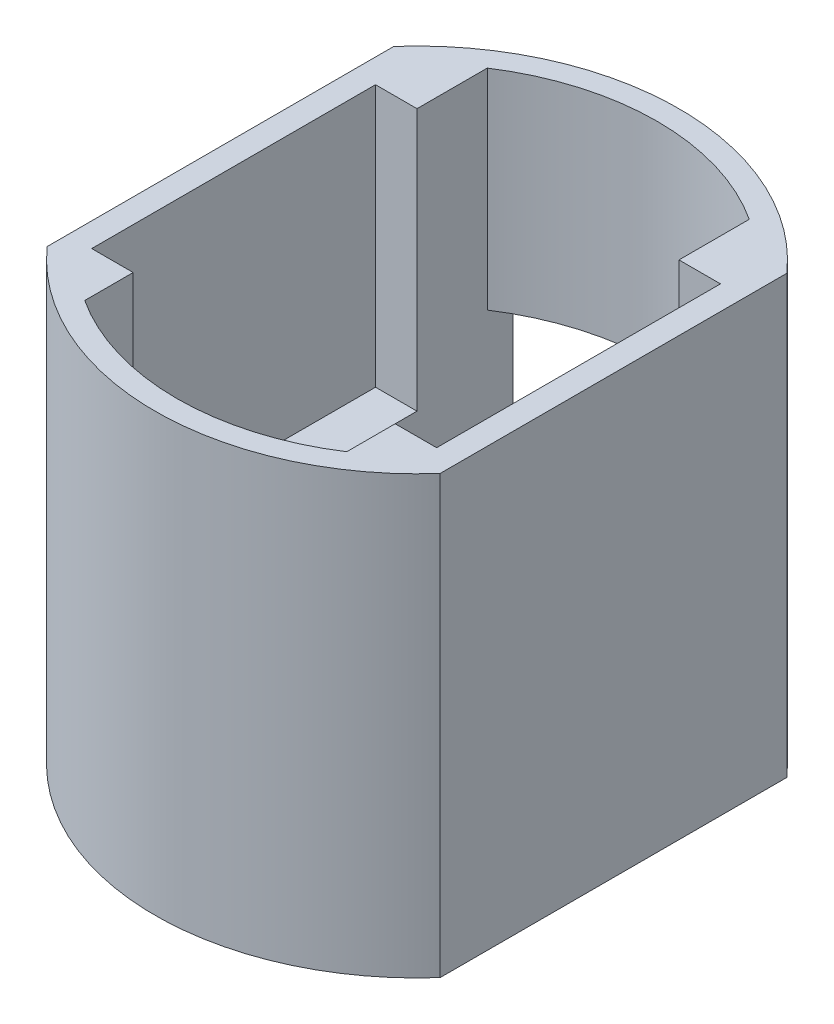
ISO-10303-21;
HEADER;
FILE_DESCRIPTION(('STEP AP214'),'2;1');
FILE_NAME('part.step','',(''),(''),'','','');
FILE_SCHEMA(('AUTOMOTIVE_DESIGN { 1 0 10303 214 1 1 1 1 }'));
ENDSEC;
DATA;
#1=APPLICATION_CONTEXT('core data for automotive mechanical design processes');
#2=APPLICATION_PROTOCOL_DEFINITION('international standard','automotive_design',2000,#1);
#3=PRODUCT_CONTEXT('',#1,'mechanical');
#4=PRODUCT('Part','Part','',(#3));
#5=PRODUCT_RELATED_PRODUCT_CATEGORY('part','',(#4));
#6=PRODUCT_DEFINITION_FORMATION('','',#4);
#7=PRODUCT_DEFINITION_CONTEXT('part definition',#1,'design');
#8=PRODUCT_DEFINITION('design','',#6,#7);
#9=PRODUCT_DEFINITION_SHAPE('','',#8);
#10=(LENGTH_UNIT() NAMED_UNIT(*) SI_UNIT(.MILLI.,.METRE.));
#11=(NAMED_UNIT(*) PLANE_ANGLE_UNIT() SI_UNIT($,.RADIAN.));
#12=(NAMED_UNIT(*) SI_UNIT($,.STERADIAN.) SOLID_ANGLE_UNIT());
#13=UNCERTAINTY_MEASURE_WITH_UNIT(LENGTH_MEASURE(1.E-05),#10,'distance_accuracy_value','');
#14=(GEOMETRIC_REPRESENTATION_CONTEXT(3) GLOBAL_UNCERTAINTY_ASSIGNED_CONTEXT((#13)) GLOBAL_UNIT_ASSIGNED_CONTEXT((#10,
#11,#12)) REPRESENTATION_CONTEXT('',''));
#15=CARTESIAN_POINT('',(0.,0.,0.));
#16=DIRECTION('',(0.,0.,1.));
#17=DIRECTION('',(1.,0.,0.));
#18=AXIS2_PLACEMENT_3D('',#15,#16,#17);
#19=CARTESIAN_POINT('',(-38.1,50.8,58.5441073038098));
#20=DIRECTION('',(-1.,0.,0.));
#21=DIRECTION('',(0.,0.,1.));
#22=AXIS2_PLACEMENT_3D('',#19,#20,#21);
#23=PLANE('',#22);
#24=DIRECTION('',(0.,0.,1.));
#25=VECTOR('',#24,1.);
#26=CARTESIAN_POINT('',(-38.1,50.8,58.5441073038098));
#27=LINE('',#26,#25);
#28=CARTESIAN_POINT('',(-38.1,50.8,44.45));
#29=VERTEX_POINT('',#28);
#30=CARTESIAN_POINT('',(-38.1,50.8,58.5441073038098));
#31=VERTEX_POINT('',#30);
#32=EDGE_CURVE('E320',#29,#31,#27,.T.);
#33=ORIENTED_EDGE('',*,*,#32,.F.);
#34=DIRECTION('',(0.,1.,0.));
#35=VECTOR('',#34,1.);
#36=CARTESIAN_POINT('',(-38.1,50.8,44.45));
#37=LINE('',#36,#35);
#38=CARTESIAN_POINT('',(-38.1,127.,44.45));
#39=VERTEX_POINT('',#38);
#40=EDGE_CURVE('E244',#29,#39,#37,.T.);
#41=ORIENTED_EDGE('',*,*,#40,.T.);
#42=DIRECTION('',(0.,0.,1.));
#43=VECTOR('',#42,1.);
#44=CARTESIAN_POINT('',(-38.1,127.,58.5441073038098));
#45=LINE('',#44,#43);
#46=CARTESIAN_POINT('',(-38.1,127.,58.5441073038098));
#47=VERTEX_POINT('',#46);
#48=EDGE_CURVE('E335',#39,#47,#45,.T.);
#49=ORIENTED_EDGE('',*,*,#48,.T.);
#50=DIRECTION('',(0.,1.,0.));
#51=VECTOR('',#50,1.);
#52=CARTESIAN_POINT('',(-38.1,50.8,58.5441073038098));
#53=LINE('',#52,#51);
#54=EDGE_CURVE('E338',#31,#47,#53,.T.);
#55=ORIENTED_EDGE('',*,*,#54,.F.);
#56=EDGE_LOOP('',(#33,#41,#49,#55));
#57=FACE_BOUND('',#56,.T.);
#58=ADVANCED_FACE('F39',(#57),#23,.F.);
#59=CARTESIAN_POINT('',(38.1,50.8,58.5441073038098));
#60=DIRECTION('',(1.,0.,0.));
#61=DIRECTION('',(0.,0.,-1.));
#62=AXIS2_PLACEMENT_3D('',#59,#60,#61);
#63=PLANE('',#62);
#64=DIRECTION('',(0.,0.,-1.));
#65=VECTOR('',#64,1.);
#66=CARTESIAN_POINT('',(38.1,127.,58.5441073038098));
#67=LINE('',#66,#65);
#68=CARTESIAN_POINT('',(38.1,127.,58.5441073038098));
#69=VERTEX_POINT('',#68);
#70=CARTESIAN_POINT('',(38.1,127.,44.45));
#71=VERTEX_POINT('',#70);
#72=EDGE_CURVE('E327',#69,#71,#67,.T.);
#73=ORIENTED_EDGE('',*,*,#72,.T.);
#74=DIRECTION('',(0.,-1.,0.));
#75=VECTOR('',#74,1.);
#76=CARTESIAN_POINT('',(38.1,50.8,44.45));
#77=LINE('',#76,#75);
#78=CARTESIAN_POINT('',(38.1,50.8,44.45));
#79=VERTEX_POINT('',#78);
#80=EDGE_CURVE('E238',#71,#79,#77,.T.);
#81=ORIENTED_EDGE('',*,*,#80,.T.);
#82=DIRECTION('',(0.,0.,-1.));
#83=VECTOR('',#82,1.);
#84=CARTESIAN_POINT('',(38.1,50.8,58.5441073038098));
#85=LINE('',#84,#83);
#86=CARTESIAN_POINT('',(38.1,50.8,58.5441073038098));
#87=VERTEX_POINT('',#86);
#88=EDGE_CURVE('E315',#87,#79,#85,.T.);
#89=ORIENTED_EDGE('',*,*,#88,.F.);
#90=DIRECTION('',(0.,1.,0.));
#91=VECTOR('',#90,1.);
#92=CARTESIAN_POINT('',(38.1,50.8,58.5441073038098));
#93=LINE('',#92,#91);
#94=EDGE_CURVE('E323',#87,#69,#93,.T.);
#95=ORIENTED_EDGE('',*,*,#94,.T.);
#96=EDGE_LOOP('',(#73,#81,#89,#95));
#97=FACE_BOUND('',#96,.T.);
#98=ADVANCED_FACE('F443',(#97),#63,.F.);
#99=CARTESIAN_POINT('',(0.,127.,0.));
#100=DIRECTION('',(0.,-1.,0.));
#101=DIRECTION('',(0.,0.,-1.));
#102=AXIS2_PLACEMENT_3D('',#99,#100,#101);
#103=CYLINDRICAL_SURFACE('',#102,76.2);
#104=CARTESIAN_POINT('',(0.,127.,0.));
#105=DIRECTION('',(0.,1.,0.));
#106=DIRECTION('',(0.,0.,1.));
#107=AXIS2_PLACEMENT_3D('',#104,#105,#106);
#108=CIRCLE('',#107,76.2);
#109=CARTESIAN_POINT('',(-57.15,127.,50.4015624757805));
#110=VERTEX_POINT('',#109);
#111=CARTESIAN_POINT('',(57.15,127.,50.4015624757805));
#112=VERTEX_POINT('',#111);
#113=EDGE_CURVE('E353',#110,#112,#108,.T.);
#114=ORIENTED_EDGE('',*,*,#113,.F.);
#115=DIRECTION('',(0.,1.,0.));
#116=VECTOR('',#115,1.);
#117=CARTESIAN_POINT('',(-57.15,0.,50.4015624757805));
#118=LINE('',#117,#116);
#119=CARTESIAN_POINT('',(-57.15,0.,50.4015624757805));
#120=VERTEX_POINT('',#119);
#121=EDGE_CURVE('E254',#120,#110,#118,.T.);
#122=ORIENTED_EDGE('',*,*,#121,.F.);
#123=CARTESIAN_POINT('',(0.,0.,0.));
#124=DIRECTION('',(0.,1.,0.));
#125=DIRECTION('',(0.,0.,1.));
#126=AXIS2_PLACEMENT_3D('',#123,#124,#125);
#127=CIRCLE('',#126,76.2);
#128=CARTESIAN_POINT('',(57.15,0.,50.4015624757805));
#129=VERTEX_POINT('',#128);
#130=EDGE_CURVE('E361',#120,#129,#127,.T.);
#131=ORIENTED_EDGE('',*,*,#130,.T.);
#132=DIRECTION('',(0.,1.,0.));
#133=VECTOR('',#132,1.);
#134=CARTESIAN_POINT('',(57.15,0.,50.4015624757805));
#135=LINE('',#134,#133);
#136=EDGE_CURVE('E55',#129,#112,#135,.T.);
#137=ORIENTED_EDGE('',*,*,#136,.T.);
#138=EDGE_LOOP('',(#114,#122,#131,#137));
#139=FACE_BOUND('',#138,.T.);
#140=ADVANCED_FACE('F388',(#139),#103,.T.);
#141=CARTESIAN_POINT('',(0.,50.8,0.));
#142=DIRECTION('',(0.,1.,0.));
#143=DIRECTION('',(0.,0.,1.));
#144=AXIS2_PLACEMENT_3D('',#141,#142,#143);
#145=CYLINDRICAL_SURFACE('',#144,69.85);
#146=CARTESIAN_POINT('',(0.,66.04,0.));
#147=DIRECTION('',(0.,-1.,0.));
#148=DIRECTION('',(0.,0.,-1.));
#149=AXIS2_PLACEMENT_3D('',#146,#147,#148);
#150=CIRCLE('',#149,69.85);
#151=CARTESIAN_POINT('',(38.1,66.04,-58.5441073038098));
#152=VERTEX_POINT('',#151);
#153=CARTESIAN_POINT('',(-38.1,66.04,-58.5441073038098));
#154=VERTEX_POINT('',#153);
#155=EDGE_CURVE('E297',#152,#154,#150,.F.);
#156=ORIENTED_EDGE('',*,*,#155,.F.);
#157=DIRECTION('',(0.,1.,0.));
#158=VECTOR('',#157,1.);
#159=CARTESIAN_POINT('',(38.1,50.8,-58.5441073038098));
#160=LINE('',#159,#158);
#161=CARTESIAN_POINT('',(38.1,127.,-58.5441073038098));
#162=VERTEX_POINT('',#161);
#163=EDGE_CURVE('E346',#152,#162,#160,.T.);
#164=ORIENTED_EDGE('',*,*,#163,.T.);
#165=CARTESIAN_POINT('',(0.,127.,0.));
#166=DIRECTION('',(0.,1.,0.));
#167=DIRECTION('',(0.,0.,1.));
#168=AXIS2_PLACEMENT_3D('',#165,#166,#167);
#169=CIRCLE('',#168,69.85);
#170=CARTESIAN_POINT('',(-38.1,127.,-58.5441073038098));
#171=VERTEX_POINT('',#170);
#172=EDGE_CURVE('E331',#162,#171,#169,.T.);
#173=ORIENTED_EDGE('',*,*,#172,.T.);
#174=DIRECTION('',(0.,1.,0.));
#175=VECTOR('',#174,1.);
#176=CARTESIAN_POINT('',(-38.1,50.8,-58.5441073038098));
#177=LINE('',#176,#175);
#178=EDGE_CURVE('E343',#154,#171,#177,.T.);
#179=ORIENTED_EDGE('',*,*,#178,.F.);
#180=EDGE_LOOP('',(#156,#164,#173,#179));
#181=FACE_BOUND('',#180,.T.);
#182=ADVANCED_FACE('F430',(#181),#145,.F.);
#183=CARTESIAN_POINT('',(-38.1,0.,-65.9911357683742));
#184=VERTEX_POINT('',#183);
#185=CARTESIAN_POINT('',(-57.15,0.,-50.4015624757805));
#186=VERTEX_POINT('',#185);
#187=EDGE_CURVE('E358',#184,#186,#127,.T.);
#188=ORIENTED_EDGE('',*,*,#187,.T.);
#189=DIRECTION('',(0.,1.,0.));
#190=VECTOR('',#189,1.);
#191=CARTESIAN_POINT('',(-57.15,0.,-50.4015624757805));
#192=LINE('',#191,#190);
#193=CARTESIAN_POINT('',(-57.15,127.,-50.4015624757805));
#194=VERTEX_POINT('',#193);
#195=EDGE_CURVE('E63',#186,#194,#192,.T.);
#196=ORIENTED_EDGE('',*,*,#195,.T.);
#197=CARTESIAN_POINT('',(57.15,127.,-50.4015624757805));
#198=VERTEX_POINT('',#197);
#199=EDGE_CURVE('E357',#198,#194,#108,.T.);
#200=ORIENTED_EDGE('',*,*,#199,.F.);
#201=DIRECTION('',(0.,1.,0.));
#202=VECTOR('',#201,1.);
#203=CARTESIAN_POINT('',(57.15,0.,-50.4015624757805));
#204=LINE('',#203,#202);
#205=CARTESIAN_POINT('',(57.15,0.,-50.4015624757805));
#206=VERTEX_POINT('',#205);
#207=EDGE_CURVE('E266',#206,#198,#204,.T.);
#208=ORIENTED_EDGE('',*,*,#207,.F.);
#209=CARTESIAN_POINT('',(38.1,0.,-65.9911357683742));
#210=VERTEX_POINT('',#209);
#211=EDGE_CURVE('E342',#206,#210,#127,.T.);
#212=ORIENTED_EDGE('',*,*,#211,.T.);
#213=DIRECTION('',(0.,-1.,0.));
#214=VECTOR('',#213,1.);
#215=CARTESIAN_POINT('',(38.1,66.04,-65.9911357683742));
#216=LINE('',#215,#214);
#217=CARTESIAN_POINT('',(38.1,66.04,-65.9911357683742));
#218=VERTEX_POINT('',#217);
#219=EDGE_CURVE('E301',#218,#210,#216,.T.);
#220=ORIENTED_EDGE('',*,*,#219,.F.);
#221=CARTESIAN_POINT('',(0.,66.04,0.));
#222=DIRECTION('',(0.,-1.,0.));
#223=DIRECTION('',(0.,0.,-1.));
#224=AXIS2_PLACEMENT_3D('',#221,#222,#223);
#225=CIRCLE('',#224,76.2);
#226=CARTESIAN_POINT('',(-38.1,66.04,-65.9911357683742));
#227=VERTEX_POINT('',#226);
#228=EDGE_CURVE('E276',#227,#218,#225,.T.);
#229=ORIENTED_EDGE('',*,*,#228,.F.);
#230=DIRECTION('',(0.,-1.,0.));
#231=VECTOR('',#230,1.);
#232=CARTESIAN_POINT('',(-38.1,66.04,-65.9911357683742));
#233=LINE('',#232,#231);
#234=EDGE_CURVE('E284',#227,#184,#233,.T.);
#235=ORIENTED_EDGE('',*,*,#234,.T.);
#236=EDGE_LOOP('',(#188,#196,#200,#208,#212,#220,#229,#235));
#237=FACE_BOUND('',#236,.T.);
#238=ADVANCED_FACE('F41',(#237),#103,.T.);
#239=CARTESIAN_POINT('',(0.,127.,0.));
#240=DIRECTION('',(0.,1.,0.));
#241=DIRECTION('',(0.,0.,1.));
#242=AXIS2_PLACEMENT_3D('',#239,#240,#241);
#243=PLANE('',#242);
#244=DIRECTION('',(-1.,0.,0.));
#245=VECTOR('',#244,1.);
#246=CARTESIAN_POINT('',(50.165,127.,-38.1));
#247=LINE('',#246,#245);
#248=CARTESIAN_POINT('',(50.165,127.,-38.1));
#249=VERTEX_POINT('',#248);
#250=CARTESIAN_POINT('',(38.1,127.,-38.1));
#251=VERTEX_POINT('',#250);
#252=EDGE_CURVE('E189',#249,#251,#247,.T.);
#253=ORIENTED_EDGE('',*,*,#252,.F.);
#254=DIRECTION('',(0.,0.,-1.));
#255=VECTOR('',#254,1.);
#256=CARTESIAN_POINT('',(50.165,127.,-38.1));
#257=LINE('',#256,#255);
#258=CARTESIAN_POINT('',(50.165,127.,44.45));
#259=VERTEX_POINT('',#258);
#260=EDGE_CURVE('E202',#259,#249,#257,.T.);
#261=ORIENTED_EDGE('',*,*,#260,.F.);
#262=DIRECTION('',(1.,0.,0.));
#263=VECTOR('',#262,1.);
#264=CARTESIAN_POINT('',(50.165,127.,44.45));
#265=LINE('',#264,#263);
#266=EDGE_CURVE('E210',#71,#259,#265,.T.);
#267=ORIENTED_EDGE('',*,*,#266,.F.);
#268=ORIENTED_EDGE('',*,*,#72,.F.);
#269=CARTESIAN_POINT('',(0.,127.,0.));
#270=DIRECTION('',(0.,1.,0.));
#271=DIRECTION('',(0.,0.,1.));
#272=AXIS2_PLACEMENT_3D('',#269,#270,#271);
#273=CIRCLE('',#272,69.85);
#274=EDGE_CURVE('E310',#47,#69,#273,.T.);
#275=ORIENTED_EDGE('',*,*,#274,.F.);
#276=ORIENTED_EDGE('',*,*,#48,.F.);
#277=CARTESIAN_POINT('',(-50.165,127.,44.45));
#278=VERTEX_POINT('',#277);
#279=EDGE_CURVE('E208',#278,#39,#265,.T.);
#280=ORIENTED_EDGE('',*,*,#279,.F.);
#281=DIRECTION('',(0.,0.,1.));
#282=VECTOR('',#281,1.);
#283=CARTESIAN_POINT('',(-50.165,127.,-38.1));
#284=LINE('',#283,#282);
#285=CARTESIAN_POINT('',(-50.165,127.,-38.1));
#286=VERTEX_POINT('',#285);
#287=EDGE_CURVE('E195',#286,#278,#284,.T.);
#288=ORIENTED_EDGE('',*,*,#287,.F.);
#289=CARTESIAN_POINT('',(-38.1,127.,-38.1));
#290=VERTEX_POINT('',#289);
#291=EDGE_CURVE('E177',#290,#286,#247,.T.);
#292=ORIENTED_EDGE('',*,*,#291,.F.);
#293=EDGE_CURVE('E316',#171,#290,#45,.T.);
#294=ORIENTED_EDGE('',*,*,#293,.F.);
#295=ORIENTED_EDGE('',*,*,#172,.F.);
#296=EDGE_CURVE('E326',#251,#162,#67,.T.);
#297=ORIENTED_EDGE('',*,*,#296,.F.);
#298=EDGE_LOOP('',(#253,#261,#267,#268,#275,#276,#280,#288,#292,#294,#295,#297));
#299=FACE_BOUND('',#298,.T.);
#300=DIRECTION('',(0.,0.,-1.));
#301=VECTOR('',#300,1.);
#302=CARTESIAN_POINT('',(-57.15,127.,-50.4015624757805));
#303=LINE('',#302,#301);
#304=EDGE_CURVE('E255',#110,#194,#303,.T.);
#305=ORIENTED_EDGE('',*,*,#304,.F.);
#306=ORIENTED_EDGE('',*,*,#113,.T.);
#307=DIRECTION('',(0.,0.,1.));
#308=VECTOR('',#307,1.);
#309=CARTESIAN_POINT('',(57.15,127.,-50.4015624757805));
#310=LINE('',#309,#308);
#311=EDGE_CURVE('E250',#198,#112,#310,.T.);
#312=ORIENTED_EDGE('',*,*,#311,.F.);
#313=ORIENTED_EDGE('',*,*,#199,.T.);
#314=EDGE_LOOP('',(#305,#306,#312,#313));
#315=FACE_BOUND('',#314,.T.);
#316=ADVANCED_FACE('F205',(#299,#315),#243,.T.);
#317=CARTESIAN_POINT('',(0.,0.,0.));
#318=DIRECTION('',(0.,1.,0.));
#319=DIRECTION('',(0.,0.,1.));
#320=AXIS2_PLACEMENT_3D('',#317,#318,#319);
#321=PLANE('',#320);
#322=ORIENTED_EDGE('',*,*,#130,.F.);
#323=DIRECTION('',(0.,0.,-1.));
#324=VECTOR('',#323,1.);
#325=CARTESIAN_POINT('',(-57.15,0.,-50.4015624757805));
#326=LINE('',#325,#324);
#327=EDGE_CURVE('E251',#120,#186,#326,.T.);
#328=ORIENTED_EDGE('',*,*,#327,.T.);
#329=ORIENTED_EDGE('',*,*,#187,.F.);
#330=DIRECTION('',(0.,0.,-1.));
#331=VECTOR('',#330,1.);
#332=CARTESIAN_POINT('',(-38.1,0.,0.));
#333=LINE('',#332,#331);
#334=CARTESIAN_POINT('',(-38.1,0.,23.1617739424834));
#335=VERTEX_POINT('',#334);
#336=EDGE_CURVE('E260',#335,#184,#333,.T.);
#337=ORIENTED_EDGE('',*,*,#336,.F.);
#338=DIRECTION('',(-1.,0.,0.));
#339=VECTOR('',#338,1.);
#340=CARTESIAN_POINT('',(0.,0.,23.1617739424834));
#341=LINE('',#340,#339);
#342=CARTESIAN_POINT('',(38.1,0.,23.1617739424834));
#343=VERTEX_POINT('',#342);
#344=EDGE_CURVE('E277',#343,#335,#341,.T.);
#345=ORIENTED_EDGE('',*,*,#344,.F.);
#346=DIRECTION('',(0.,0.,-1.));
#347=VECTOR('',#346,1.);
#348=CARTESIAN_POINT('',(38.1,0.,0.));
#349=LINE('',#348,#347);
#350=EDGE_CURVE('E287',#343,#210,#349,.T.);
#351=ORIENTED_EDGE('',*,*,#350,.T.);
#352=ORIENTED_EDGE('',*,*,#211,.F.);
#353=DIRECTION('',(0.,0.,1.));
#354=VECTOR('',#353,1.);
#355=CARTESIAN_POINT('',(57.15,0.,-50.4015624757805));
#356=LINE('',#355,#354);
#357=EDGE_CURVE('E263',#206,#129,#356,.T.);
#358=ORIENTED_EDGE('',*,*,#357,.T.);
#359=EDGE_LOOP('',(#322,#328,#329,#337,#345,#351,#352,#358));
#360=FACE_BOUND('',#359,.T.);
#361=ADVANCED_FACE('F382',(#360),#321,.F.);
#362=CARTESIAN_POINT('',(0.,50.8,0.));
#363=DIRECTION('',(0.,1.,0.));
#364=DIRECTION('',(0.,0.,1.));
#365=AXIS2_PLACEMENT_3D('',#362,#363,#364);
#366=CYLINDRICAL_SURFACE('',#365,69.85);
#367=ORIENTED_EDGE('',*,*,#274,.T.);
#368=ORIENTED_EDGE('',*,*,#94,.F.);
#369=CARTESIAN_POINT('',(0.,50.8,0.));
#370=DIRECTION('',(0.,1.,0.));
#371=DIRECTION('',(0.,0.,1.));
#372=AXIS2_PLACEMENT_3D('',#369,#370,#371);
#373=CIRCLE('',#372,69.85);
#374=EDGE_CURVE('E311',#31,#87,#373,.T.);
#375=ORIENTED_EDGE('',*,*,#374,.F.);
#376=ORIENTED_EDGE('',*,*,#54,.T.);
#377=EDGE_LOOP('',(#367,#368,#375,#376));
#378=FACE_BOUND('',#377,.T.);
#379=ADVANCED_FACE('F438',(#378),#366,.F.);
#380=ORIENTED_EDGE('',*,*,#293,.T.);
#381=DIRECTION('',(0.,-1.,0.));
#382=VECTOR('',#381,1.);
#383=CARTESIAN_POINT('',(-38.1,50.8,-38.1));
#384=LINE('',#383,#382);
#385=CARTESIAN_POINT('',(-38.1,50.8,-38.1));
#386=VERTEX_POINT('',#385);
#387=EDGE_CURVE('E183',#290,#386,#384,.T.);
#388=ORIENTED_EDGE('',*,*,#387,.T.);
#389=DIRECTION('',(0.,0.,-1.));
#390=VECTOR('',#389,1.);
#391=CARTESIAN_POINT('',(-38.1,50.8,58.5441073038098));
#392=LINE('',#391,#390);
#393=CARTESIAN_POINT('',(-38.1,50.8,23.1617739424834));
#394=VERTEX_POINT('',#393);
#395=EDGE_CURVE('E233',#394,#386,#392,.T.);
#396=ORIENTED_EDGE('',*,*,#395,.F.);
#397=DIRECTION('',(0.,-1.,0.));
#398=VECTOR('',#397,1.);
#399=CARTESIAN_POINT('',(-38.1,66.04,23.1617739424834));
#400=LINE('',#399,#398);
#401=EDGE_CURVE('E294',#394,#335,#400,.T.);
#402=ORIENTED_EDGE('',*,*,#401,.T.);
#403=ORIENTED_EDGE('',*,*,#336,.T.);
#404=ORIENTED_EDGE('',*,*,#234,.F.);
#405=DIRECTION('',(0.,0.,-1.));
#406=VECTOR('',#405,1.);
#407=CARTESIAN_POINT('',(-38.1,66.04,0.));
#408=LINE('',#407,#406);
#409=EDGE_CURVE('E273',#154,#227,#408,.T.);
#410=ORIENTED_EDGE('',*,*,#409,.F.);
#411=ORIENTED_EDGE('',*,*,#178,.T.);
#412=EDGE_LOOP('',(#380,#388,#396,#402,#403,#404,#410,#411));
#413=FACE_BOUND('',#412,.T.);
#414=ADVANCED_FACE('F424',(#413),#23,.F.);
#415=DIRECTION('',(0.,0.,1.));
#416=VECTOR('',#415,1.);
#417=CARTESIAN_POINT('',(38.1,50.8,58.5441073038098));
#418=LINE('',#417,#416);
#419=CARTESIAN_POINT('',(38.1,50.8,-38.1));
#420=VERTEX_POINT('',#419);
#421=CARTESIAN_POINT('',(38.1,50.8,23.1617739424834));
#422=VERTEX_POINT('',#421);
#423=EDGE_CURVE('E235',#420,#422,#418,.T.);
#424=ORIENTED_EDGE('',*,*,#423,.F.);
#425=DIRECTION('',(0.,1.,0.));
#426=VECTOR('',#425,1.);
#427=CARTESIAN_POINT('',(38.1,50.8,-38.1));
#428=LINE('',#427,#426);
#429=EDGE_CURVE('E11',#420,#251,#428,.T.);
#430=ORIENTED_EDGE('',*,*,#429,.T.);
#431=ORIENTED_EDGE('',*,*,#296,.T.);
#432=ORIENTED_EDGE('',*,*,#163,.F.);
#433=DIRECTION('',(0.,0.,-1.));
#434=VECTOR('',#433,1.);
#435=CARTESIAN_POINT('',(38.1,66.04,0.));
#436=LINE('',#435,#434);
#437=EDGE_CURVE('E281',#152,#218,#436,.T.);
#438=ORIENTED_EDGE('',*,*,#437,.T.);
#439=ORIENTED_EDGE('',*,*,#219,.T.);
#440=ORIENTED_EDGE('',*,*,#350,.F.);
#441=DIRECTION('',(0.,-1.,0.));
#442=VECTOR('',#441,1.);
#443=CARTESIAN_POINT('',(38.1,66.04,23.1617739424834));
#444=LINE('',#443,#442);
#445=EDGE_CURVE('E298',#422,#343,#444,.T.);
#446=ORIENTED_EDGE('',*,*,#445,.F.);
#447=EDGE_LOOP('',(#424,#430,#431,#432,#438,#439,#440,#446));
#448=FACE_BOUND('',#447,.T.);
#449=ADVANCED_FACE('F395',(#448),#63,.F.);
#450=CARTESIAN_POINT('',(0.,50.8,0.));
#451=DIRECTION('',(0.,1.,0.));
#452=DIRECTION('',(0.,0.,1.));
#453=AXIS2_PLACEMENT_3D('',#450,#451,#452);
#454=PLANE('',#453);
#455=ORIENTED_EDGE('',*,*,#88,.T.);
#456=DIRECTION('',(-1.,0.,0.));
#457=VECTOR('',#456,1.);
#458=CARTESIAN_POINT('',(50.165,50.8,44.45));
#459=LINE('',#458,#457);
#460=CARTESIAN_POINT('',(50.165,50.8,44.45));
#461=VERTEX_POINT('',#460);
#462=EDGE_CURVE('E412',#461,#79,#459,.T.);
#463=ORIENTED_EDGE('',*,*,#462,.F.);
#464=DIRECTION('',(0.,0.,1.));
#465=VECTOR('',#464,1.);
#466=CARTESIAN_POINT('',(50.165,50.8,-38.1));
#467=LINE('',#466,#465);
#468=CARTESIAN_POINT('',(50.165,50.8,-38.1));
#469=VERTEX_POINT('',#468);
#470=EDGE_CURVE('E406',#469,#461,#467,.T.);
#471=ORIENTED_EDGE('',*,*,#470,.F.);
#472=DIRECTION('',(1.,0.,0.));
#473=VECTOR('',#472,1.);
#474=CARTESIAN_POINT('',(50.165,50.8,-38.1));
#475=LINE('',#474,#473);
#476=EDGE_CURVE('E404',#420,#469,#475,.T.);
#477=ORIENTED_EDGE('',*,*,#476,.F.);
#478=ORIENTED_EDGE('',*,*,#423,.T.);
#479=DIRECTION('',(1.,0.,0.));
#480=VECTOR('',#479,1.);
#481=CARTESIAN_POINT('',(0.,50.8,23.1617739424834));
#482=LINE('',#481,#480);
#483=EDGE_CURVE('E48',#394,#422,#482,.T.);
#484=ORIENTED_EDGE('',*,*,#483,.F.);
#485=ORIENTED_EDGE('',*,*,#395,.T.);
#486=CARTESIAN_POINT('',(-50.165,50.8,-38.1));
#487=VERTEX_POINT('',#486);
#488=EDGE_CURVE('E234',#487,#386,#475,.T.);
#489=ORIENTED_EDGE('',*,*,#488,.F.);
#490=DIRECTION('',(0.,0.,-1.));
#491=VECTOR('',#490,1.);
#492=CARTESIAN_POINT('',(-50.165,50.8,-38.1));
#493=LINE('',#492,#491);
#494=CARTESIAN_POINT('',(-50.165,50.8,44.45));
#495=VERTEX_POINT('',#494);
#496=EDGE_CURVE('E198',#495,#487,#493,.T.);
#497=ORIENTED_EDGE('',*,*,#496,.F.);
#498=EDGE_CURVE('E224',#29,#495,#459,.T.);
#499=ORIENTED_EDGE('',*,*,#498,.F.);
#500=ORIENTED_EDGE('',*,*,#32,.T.);
#501=ORIENTED_EDGE('',*,*,#374,.T.);
#502=EDGE_LOOP('',(#455,#463,#471,#477,#478,#484,#485,#489,#497,#499,#500,#501));
#503=FACE_BOUND('',#502,.T.);
#504=ADVANCED_FACE('F402',(#503),#454,.T.);
#505=CARTESIAN_POINT('',(0.,66.04,0.));
#506=DIRECTION('',(0.,-1.,0.));
#507=DIRECTION('',(0.,0.,-1.));
#508=AXIS2_PLACEMENT_3D('',#505,#506,#507);
#509=PLANE('',#508);
#510=ORIENTED_EDGE('',*,*,#155,.T.);
#511=ORIENTED_EDGE('',*,*,#409,.T.);
#512=ORIENTED_EDGE('',*,*,#228,.T.);
#513=ORIENTED_EDGE('',*,*,#437,.F.);
#514=EDGE_LOOP('',(#510,#511,#512,#513));
#515=FACE_BOUND('',#514,.T.);
#516=ADVANCED_FACE('F503',(#515),#509,.T.);
#517=CARTESIAN_POINT('',(0.,66.04,23.1617739424834));
#518=DIRECTION('',(0.,0.,1.));
#519=DIRECTION('',(1.,0.,0.));
#520=AXIS2_PLACEMENT_3D('',#517,#518,#519);
#521=PLANE('',#520);
#522=ORIENTED_EDGE('',*,*,#483,.T.);
#523=ORIENTED_EDGE('',*,*,#445,.T.);
#524=ORIENTED_EDGE('',*,*,#344,.T.);
#525=ORIENTED_EDGE('',*,*,#401,.F.);
#526=EDGE_LOOP('',(#522,#523,#524,#525));
#527=FACE_BOUND('',#526,.T.);
#528=ADVANCED_FACE('F398',(#527),#521,.F.);
#529=CARTESIAN_POINT('',(57.15,0.,-50.4015624757805));
#530=DIRECTION('',(-1.,0.,0.));
#531=DIRECTION('',(0.,0.,1.));
#532=AXIS2_PLACEMENT_3D('',#529,#530,#531);
#533=PLANE('',#532);
#534=ORIENTED_EDGE('',*,*,#311,.T.);
#535=ORIENTED_EDGE('',*,*,#136,.F.);
#536=ORIENTED_EDGE('',*,*,#357,.F.);
#537=ORIENTED_EDGE('',*,*,#207,.T.);
#538=EDGE_LOOP('',(#534,#535,#536,#537));
#539=FACE_BOUND('',#538,.T.);
#540=ADVANCED_FACE('F521',(#539),#533,.F.);
#541=CARTESIAN_POINT('',(-57.15,0.,-50.4015624757805));
#542=DIRECTION('',(1.,0.,0.));
#543=DIRECTION('',(0.,0.,-1.));
#544=AXIS2_PLACEMENT_3D('',#541,#542,#543);
#545=PLANE('',#544);
#546=ORIENTED_EDGE('',*,*,#304,.T.);
#547=ORIENTED_EDGE('',*,*,#195,.F.);
#548=ORIENTED_EDGE('',*,*,#327,.F.);
#549=ORIENTED_EDGE('',*,*,#121,.T.);
#550=EDGE_LOOP('',(#546,#547,#548,#549));
#551=FACE_BOUND('',#550,.T.);
#552=ADVANCED_FACE('F386',(#551),#545,.F.);
#553=CARTESIAN_POINT('',(50.165,-79.1254070611288,44.45));
#554=DIRECTION('',(0.,0.,1.));
#555=DIRECTION('',(1.,0.,0.));
#556=AXIS2_PLACEMENT_3D('',#553,#554,#555);
#557=PLANE('',#556);
#558=ORIENTED_EDGE('',*,*,#266,.T.);
#559=DIRECTION('',(0.,1.,0.));
#560=VECTOR('',#559,1.);
#561=CARTESIAN_POINT('',(50.165,-79.1254070611288,44.45));
#562=LINE('',#561,#560);
#563=EDGE_CURVE('E225',#461,#259,#562,.T.);
#564=ORIENTED_EDGE('',*,*,#563,.F.);
#565=ORIENTED_EDGE('',*,*,#462,.T.);
#566=ORIENTED_EDGE('',*,*,#80,.F.);
#567=EDGE_LOOP('',(#558,#564,#565,#566));
#568=FACE_BOUND('',#567,.T.);
#569=ADVANCED_FACE('F445',(#568),#557,.F.);
#570=CARTESIAN_POINT('',(50.165,-79.1254070611288,-38.1));
#571=DIRECTION('',(0.,0.,-1.));
#572=DIRECTION('',(-1.,0.,0.));
#573=AXIS2_PLACEMENT_3D('',#570,#571,#572);
#574=PLANE('',#573);
#575=ORIENTED_EDGE('',*,*,#476,.T.);
#576=DIRECTION('',(0.,1.,0.));
#577=VECTOR('',#576,1.);
#578=CARTESIAN_POINT('',(50.165,-79.1254070611288,-38.1));
#579=LINE('',#578,#577);
#580=EDGE_CURVE('E221',#469,#249,#579,.T.);
#581=ORIENTED_EDGE('',*,*,#580,.T.);
#582=ORIENTED_EDGE('',*,*,#252,.T.);
#583=ORIENTED_EDGE('',*,*,#429,.F.);
#584=EDGE_LOOP('',(#575,#581,#582,#583));
#585=FACE_BOUND('',#584,.T.);
#586=ADVANCED_FACE('F448',(#585),#574,.F.);
#587=CARTESIAN_POINT('',(50.165,-79.1254070611288,-38.1));
#588=DIRECTION('',(1.,0.,0.));
#589=DIRECTION('',(0.,0.,-1.));
#590=AXIS2_PLACEMENT_3D('',#587,#588,#589);
#591=PLANE('',#590);
#592=ORIENTED_EDGE('',*,*,#470,.T.);
#593=ORIENTED_EDGE('',*,*,#563,.T.);
#594=ORIENTED_EDGE('',*,*,#260,.T.);
#595=ORIENTED_EDGE('',*,*,#580,.F.);
#596=EDGE_LOOP('',(#592,#593,#594,#595));
#597=FACE_BOUND('',#596,.T.);
#598=ADVANCED_FACE('F447',(#597),#591,.F.);
#599=ORIENTED_EDGE('',*,*,#291,.T.);
#600=DIRECTION('',(0.,1.,0.));
#601=VECTOR('',#600,1.);
#602=CARTESIAN_POINT('',(-50.165,-79.1254070611288,-38.1));
#603=LINE('',#602,#601);
#604=EDGE_CURVE('E181',#487,#286,#603,.T.);
#605=ORIENTED_EDGE('',*,*,#604,.F.);
#606=ORIENTED_EDGE('',*,*,#488,.T.);
#607=ORIENTED_EDGE('',*,*,#387,.F.);
#608=EDGE_LOOP('',(#599,#605,#606,#607));
#609=FACE_BOUND('',#608,.T.);
#610=ADVANCED_FACE('F179',(#609),#574,.F.);
#611=ORIENTED_EDGE('',*,*,#498,.T.);
#612=DIRECTION('',(0.,1.,0.));
#613=VECTOR('',#612,1.);
#614=CARTESIAN_POINT('',(-50.165,-79.1254070611288,44.45));
#615=LINE('',#614,#613);
#616=EDGE_CURVE('E201',#495,#278,#615,.T.);
#617=ORIENTED_EDGE('',*,*,#616,.T.);
#618=ORIENTED_EDGE('',*,*,#279,.T.);
#619=ORIENTED_EDGE('',*,*,#40,.F.);
#620=EDGE_LOOP('',(#611,#617,#618,#619));
#621=FACE_BOUND('',#620,.T.);
#622=ADVANCED_FACE('F421',(#621),#557,.F.);
#623=CARTESIAN_POINT('',(-50.165,-79.1254070611288,-38.1));
#624=DIRECTION('',(-1.,0.,0.));
#625=DIRECTION('',(0.,0.,1.));
#626=AXIS2_PLACEMENT_3D('',#623,#624,#625);
#627=PLANE('',#626);
#628=ORIENTED_EDGE('',*,*,#496,.T.);
#629=ORIENTED_EDGE('',*,*,#604,.T.);
#630=ORIENTED_EDGE('',*,*,#287,.T.);
#631=ORIENTED_EDGE('',*,*,#616,.F.);
#632=EDGE_LOOP('',(#628,#629,#630,#631));
#633=FACE_BOUND('',#632,.T.);
#634=ADVANCED_FACE('F193',(#633),#627,.F.);
#635=CLOSED_SHELL('',(#58,#98,#140,#182,#238,#316,#361,#379,#414,#449,#504,#516,#528,#540,#552,
#569,#586,#598,#610,#622,#634));
#636=MANIFOLD_SOLID_BREP('B2',#635);
#637=ADVANCED_BREP_SHAPE_REPRESENTATION('',(#18,#636),#14);
#638=SHAPE_DEFINITION_REPRESENTATION(#9,#637);
ENDSEC;
END-ISO-10303-21;
